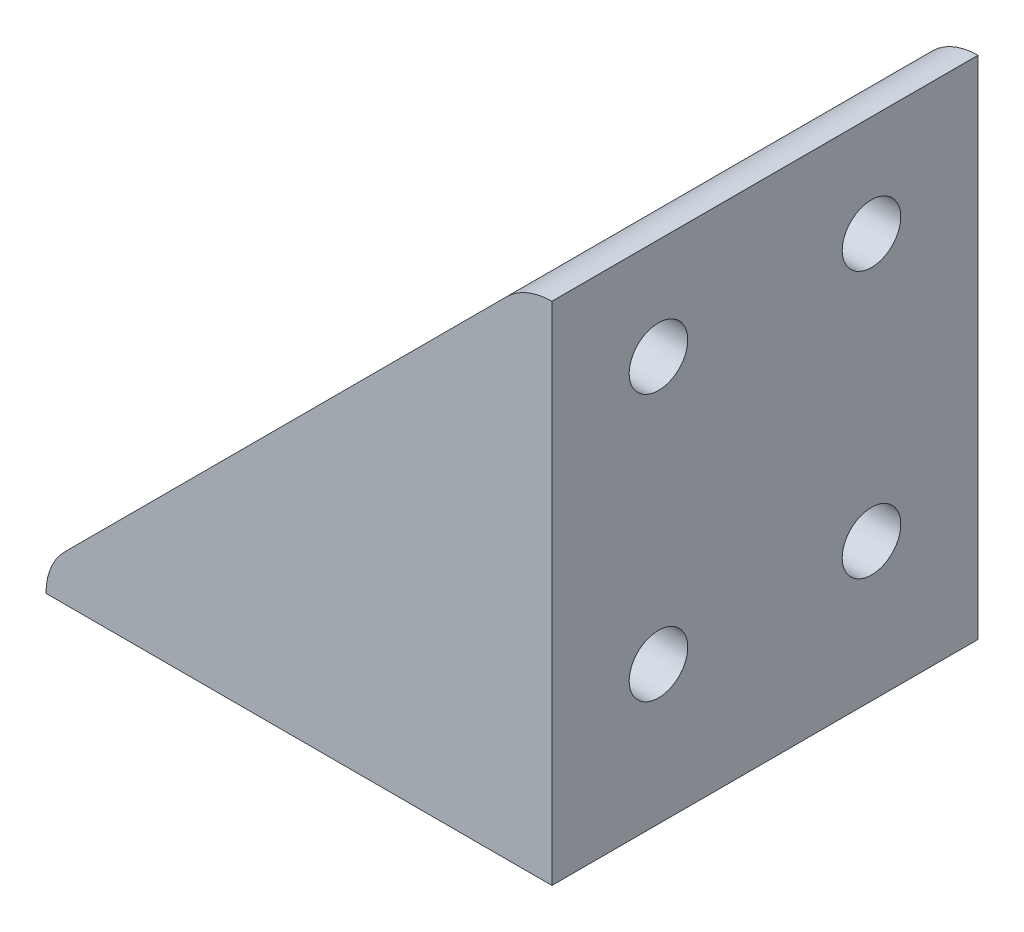
ISO-10303-21;
HEADER;
FILE_DESCRIPTION(('STEP AP214'),'2;1');
FILE_NAME('part.step','',(''),(''),'','','');
FILE_SCHEMA(('AUTOMOTIVE_DESIGN { 1 0 10303 214 1 1 1 1 }'));
ENDSEC;
DATA;
#1=APPLICATION_CONTEXT('core data for automotive mechanical design processes');
#2=APPLICATION_PROTOCOL_DEFINITION('international standard','automotive_design',2000,#1);
#3=PRODUCT_CONTEXT('',#1,'mechanical');
#4=PRODUCT('Part','Part','',(#3));
#5=PRODUCT_RELATED_PRODUCT_CATEGORY('part','',(#4));
#6=PRODUCT_DEFINITION_FORMATION('','',#4);
#7=PRODUCT_DEFINITION_CONTEXT('part definition',#1,'design');
#8=PRODUCT_DEFINITION('design','',#6,#7);
#9=PRODUCT_DEFINITION_SHAPE('','',#8);
#10=(LENGTH_UNIT() NAMED_UNIT(*) SI_UNIT(.MILLI.,.METRE.));
#11=(NAMED_UNIT(*) PLANE_ANGLE_UNIT() SI_UNIT($,.RADIAN.));
#12=(NAMED_UNIT(*) SI_UNIT($,.STERADIAN.) SOLID_ANGLE_UNIT());
#13=UNCERTAINTY_MEASURE_WITH_UNIT(LENGTH_MEASURE(1.E-05),#10,'distance_accuracy_value','');
#14=(GEOMETRIC_REPRESENTATION_CONTEXT(3) GLOBAL_UNCERTAINTY_ASSIGNED_CONTEXT((#13)) GLOBAL_UNIT_ASSIGNED_CONTEXT((#10,
#11,#12)) REPRESENTATION_CONTEXT('',''));
#15=CARTESIAN_POINT('',(0.,0.,0.));
#16=DIRECTION('',(0.,0.,1.));
#17=DIRECTION('',(1.,0.,0.));
#18=AXIS2_PLACEMENT_3D('',#15,#16,#17);
#19=CARTESIAN_POINT('',(20.,50.,20.));
#20=DIRECTION('',(-1.,0.,0.));
#21=DIRECTION('',(0.,0.,1.));
#22=AXIS2_PLACEMENT_3D('',#19,#20,#21);
#23=PLANE('',#22);
#24=CARTESIAN_POINT('',(20.,13.,-10.));
#25=DIRECTION('',(-1.,0.,0.));
#26=DIRECTION('',(0.,0.,1.));
#27=AXIS2_PLACEMENT_3D('',#24,#25,#26);
#28=CIRCLE('',#27,2.75);
#29=CARTESIAN_POINT('',(20.,13.,-7.25));
#30=VERTEX_POINT('',#29);
#31=EDGE_CURVE('E283',#30,#30,#28,.T.);
#32=ORIENTED_EDGE('',*,*,#31,.F.);
#33=EDGE_LOOP('',(#32));
#34=FACE_BOUND('',#33,.T.);
#35=CARTESIAN_POINT('',(20.,38.,-10.));
#36=DIRECTION('',(-1.,0.,0.));
#37=DIRECTION('',(0.,0.,1.));
#38=AXIS2_PLACEMENT_3D('',#35,#36,#37);
#39=CIRCLE('',#38,2.75);
#40=CARTESIAN_POINT('',(20.,38.,-7.25));
#41=VERTEX_POINT('',#40);
#42=EDGE_CURVE('E275',#41,#41,#39,.T.);
#43=ORIENTED_EDGE('',*,*,#42,.F.);
#44=EDGE_LOOP('',(#43));
#45=FACE_BOUND('',#44,.T.);
#46=DIRECTION('',(0.,0.,-1.));
#47=VECTOR('',#46,1.);
#48=CARTESIAN_POINT('',(20.,5.,0.));
#49=LINE('',#48,#47);
#50=CARTESIAN_POINT('',(20.,5.,-2.));
#51=VERTEX_POINT('',#50);
#52=CARTESIAN_POINT('',(20.,5.,-16.));
#53=VERTEX_POINT('',#52);
#54=EDGE_CURVE('E305',#51,#53,#49,.T.);
#55=ORIENTED_EDGE('',*,*,#54,.F.);
#56=DIRECTION('',(0.,-1.,0.));
#57=VECTOR('',#56,1.);
#58=CARTESIAN_POINT('',(20.,0.,-2.));
#59=LINE('',#58,#57);
#60=CARTESIAN_POINT('',(20.,45.,-2.));
#61=VERTEX_POINT('',#60);
#62=EDGE_CURVE('E586',#61,#51,#59,.T.);
#63=ORIENTED_EDGE('',*,*,#62,.F.);
#64=DIRECTION('',(0.,0.,-1.));
#65=VECTOR('',#64,1.);
#66=CARTESIAN_POINT('',(20.,45.,-20.));
#67=LINE('',#66,#65);
#68=CARTESIAN_POINT('',(20.,45.,-16.));
#69=VERTEX_POINT('',#68);
#70=EDGE_CURVE('E160',#61,#69,#67,.T.);
#71=ORIENTED_EDGE('',*,*,#70,.T.);
#72=DIRECTION('',(0.,1.,0.));
#73=VECTOR('',#72,1.);
#74=CARTESIAN_POINT('',(20.,5.,-16.));
#75=LINE('',#74,#73);
#76=EDGE_CURVE('E271',#53,#69,#75,.T.);
#77=ORIENTED_EDGE('',*,*,#76,.F.);
#78=EDGE_LOOP('',(#55,#63,#71,#77));
#79=FACE_BOUND('',#78,.T.);
#80=ADVANCED_FACE('F39',(#34,#45,#79),#23,.T.);
#81=CARTESIAN_POINT('',(0.,5.,0.));
#82=DIRECTION('',(0.,-1.,0.));
#83=DIRECTION('',(0.,0.,-1.));
#84=AXIS2_PLACEMENT_3D('',#81,#82,#83);
#85=PLANE('',#84);
#86=CARTESIAN_POINT('',(12.,5.,-10.));
#87=DIRECTION('',(0.,1.,0.));
#88=DIRECTION('',(0.,0.,1.));
#89=AXIS2_PLACEMENT_3D('',#86,#87,#88);
#90=CIRCLE('',#89,2.74999999999999);
#91=CARTESIAN_POINT('',(12.,5.,-7.25000000000002));
#92=VERTEX_POINT('',#91);
#93=EDGE_CURVE('E593',#92,#92,#90,.T.);
#94=ORIENTED_EDGE('',*,*,#93,.F.);
#95=EDGE_LOOP('',(#94));
#96=FACE_BOUND('',#95,.T.);
#97=CARTESIAN_POINT('',(-13.,5.,-10.));
#98=DIRECTION('',(0.,1.,0.));
#99=DIRECTION('',(0.,0.,1.));
#100=AXIS2_PLACEMENT_3D('',#97,#98,#99);
#101=CIRCLE('',#100,2.74999999999999);
#102=CARTESIAN_POINT('',(-13.,5.,-7.25000000000002));
#103=VERTEX_POINT('',#102);
#104=EDGE_CURVE('E614',#103,#103,#101,.T.);
#105=ORIENTED_EDGE('',*,*,#104,.F.);
#106=EDGE_LOOP('',(#105));
#107=FACE_BOUND('',#106,.T.);
#108=DIRECTION('',(1.,0.,0.));
#109=VECTOR('',#108,1.);
#110=CARTESIAN_POINT('',(0.,5.,-2.));
#111=LINE('',#110,#109);
#112=CARTESIAN_POINT('',(-20.,5.,-2.));
#113=VERTEX_POINT('',#112);
#114=EDGE_CURVE('E591',#113,#51,#111,.T.);
#115=ORIENTED_EDGE('',*,*,#114,.T.);
#116=ORIENTED_EDGE('',*,*,#54,.T.);
#117=DIRECTION('',(1.,0.,0.));
#118=VECTOR('',#117,1.);
#119=CARTESIAN_POINT('',(-20.,5.,-16.));
#120=LINE('',#119,#118);
#121=CARTESIAN_POINT('',(-20.,5.,-16.));
#122=VERTEX_POINT('',#121);
#123=EDGE_CURVE('E267',#122,#53,#120,.T.);
#124=ORIENTED_EDGE('',*,*,#123,.F.);
#125=DIRECTION('',(0.,0.,1.));
#126=VECTOR('',#125,1.);
#127=CARTESIAN_POINT('',(-20.,5.,0.));
#128=LINE('',#127,#126);
#129=EDGE_CURVE('E167',#122,#113,#128,.T.);
#130=ORIENTED_EDGE('',*,*,#129,.T.);
#131=EDGE_LOOP('',(#115,#116,#124,#130));
#132=FACE_BOUND('',#131,.T.);
#133=ADVANCED_FACE('F334',(#96,#107,#132),#85,.F.);
#134=CARTESIAN_POINT('',(-25.,0.,-20.));
#135=DIRECTION('',(0.707106781186548,-0.707106781186548,0.));
#136=DIRECTION('',(0.707106781186548,0.707106781186548,0.));
#137=AXIS2_PLACEMENT_3D('',#134,#135,#136);
#138=PLANE('',#137);
#139=DIRECTION('',(-0.707106781186547,-0.707106781186548,0.));
#140=VECTOR('',#139,1.);
#141=CARTESIAN_POINT('',(-12.5,12.5,2.));
#142=LINE('',#141,#140);
#143=CARTESIAN_POINT('',(20.,45.,2.));
#144=VERTEX_POINT('',#143);
#145=CARTESIAN_POINT('',(-20.,5.,2.));
#146=VERTEX_POINT('',#145);
#147=EDGE_CURVE('E56',#144,#146,#142,.T.);
#148=ORIENTED_EDGE('',*,*,#147,.F.);
#149=CARTESIAN_POINT('',(20.,45.,16.));
#150=VERTEX_POINT('',#149);
#151=EDGE_CURVE('E140',#150,#144,#67,.T.);
#152=ORIENTED_EDGE('',*,*,#151,.F.);
#153=DIRECTION('',(0.707106781186547,0.707106781186548,0.));
#154=VECTOR('',#153,1.);
#155=CARTESIAN_POINT('',(-20.,5.,16.));
#156=LINE('',#155,#154);
#157=CARTESIAN_POINT('',(-20.,5.,16.));
#158=VERTEX_POINT('',#157);
#159=EDGE_CURVE('E249',#158,#150,#156,.T.);
#160=ORIENTED_EDGE('',*,*,#159,.F.);
#161=EDGE_CURVE('E142',#146,#158,#128,.T.);
#162=ORIENTED_EDGE('',*,*,#161,.F.);
#163=EDGE_LOOP('',(#148,#152,#160,#162));
#164=FACE_BOUND('',#163,.T.);
#165=DIRECTION('',(0.707106781186547,0.707106781186547,0.));
#166=VECTOR('',#165,1.);
#167=CARTESIAN_POINT('',(-25.,0.,-20.));
#168=LINE('',#167,#166);
#169=CARTESIAN_POINT('',(-20.7426406871193,4.25735931288071,-20.));
#170=VERTEX_POINT('',#169);
#171=CARTESIAN_POINT('',(20.7426406871193,45.7426406871193,-20.));
#172=VERTEX_POINT('',#171);
#173=EDGE_CURVE('E165',#170,#172,#168,.T.);
#174=ORIENTED_EDGE('',*,*,#173,.F.);
#175=DIRECTION('',(0.,0.,1.));
#176=VECTOR('',#175,1.);
#177=CARTESIAN_POINT('',(-20.7426406871193,4.25735931288071,-20.));
#178=LINE('',#177,#176);
#179=CARTESIAN_POINT('',(-20.7426406871193,4.25735931288071,20.));
#180=VERTEX_POINT('',#179);
#181=EDGE_CURVE('E198',#170,#180,#178,.T.);
#182=ORIENTED_EDGE('',*,*,#181,.T.);
#183=DIRECTION('',(0.707106781186547,0.707106781186547,0.));
#184=VECTOR('',#183,1.);
#185=CARTESIAN_POINT('',(-25.,0.,20.));
#186=LINE('',#185,#184);
#187=CARTESIAN_POINT('',(20.7426406871193,45.7426406871193,20.));
#188=VERTEX_POINT('',#187);
#189=EDGE_CURVE('E159',#180,#188,#186,.T.);
#190=ORIENTED_EDGE('',*,*,#189,.T.);
#191=DIRECTION('',(0.,0.,1.));
#192=VECTOR('',#191,1.);
#193=CARTESIAN_POINT('',(20.7426406871193,45.7426406871193,-20.));
#194=LINE('',#193,#192);
#195=EDGE_CURVE('E195',#188,#172,#194,.F.);
#196=ORIENTED_EDGE('',*,*,#195,.T.);
#197=EDGE_LOOP('',(#174,#182,#190,#196));
#198=FACE_BOUND('',#197,.T.);
#199=ORIENTED_EDGE('',*,*,#70,.F.);
#200=DIRECTION('',(-0.707106781186547,-0.707106781186548,0.));
#201=VECTOR('',#200,1.);
#202=CARTESIAN_POINT('',(-12.5,12.5,-2.));
#203=LINE('',#202,#201);
#204=EDGE_CURVE('E589',#61,#113,#203,.T.);
#205=ORIENTED_EDGE('',*,*,#204,.T.);
#206=ORIENTED_EDGE('',*,*,#129,.F.);
#207=DIRECTION('',(-0.707106781186547,-0.707106781186548,0.));
#208=VECTOR('',#207,1.);
#209=CARTESIAN_POINT('',(20.,45.,-16.));
#210=LINE('',#209,#208);
#211=EDGE_CURVE('E263',#69,#122,#210,.T.);
#212=ORIENTED_EDGE('',*,*,#211,.F.);
#213=EDGE_LOOP('',(#199,#205,#206,#212));
#214=FACE_BOUND('',#213,.T.);
#215=ADVANCED_FACE('F136',(#164,#198,#214),#138,.F.);
#216=CARTESIAN_POINT('',(25.,50.,20.));
#217=DIRECTION('',(-1.,0.,0.));
#218=DIRECTION('',(0.,0.,1.));
#219=AXIS2_PLACEMENT_3D('',#216,#217,#218);
#220=PLANE('',#219);
#221=CARTESIAN_POINT('',(25.,38.,-10.));
#222=DIRECTION('',(-1.,0.,0.));
#223=DIRECTION('',(0.,0.,1.));
#224=AXIS2_PLACEMENT_3D('',#221,#222,#223);
#225=CIRCLE('',#224,2.75);
#226=CARTESIAN_POINT('',(25.,38.,-7.25));
#227=VERTEX_POINT('',#226);
#228=EDGE_CURVE('E279',#227,#227,#225,.T.);
#229=ORIENTED_EDGE('',*,*,#228,.T.);
#230=EDGE_LOOP('',(#229));
#231=FACE_BOUND('',#230,.T.);
#232=CARTESIAN_POINT('',(25.,13.,-10.));
#233=DIRECTION('',(-1.,0.,0.));
#234=DIRECTION('',(0.,0.,1.));
#235=AXIS2_PLACEMENT_3D('',#232,#233,#234);
#236=CIRCLE('',#235,2.75);
#237=CARTESIAN_POINT('',(25.,13.,-7.25));
#238=VERTEX_POINT('',#237);
#239=EDGE_CURVE('E287',#238,#238,#236,.T.);
#240=ORIENTED_EDGE('',*,*,#239,.T.);
#241=EDGE_LOOP('',(#240));
#242=FACE_BOUND('',#241,.T.);
#243=CARTESIAN_POINT('',(25.,13.,10.));
#244=DIRECTION('',(-1.,0.,0.));
#245=DIRECTION('',(0.,0.,1.));
#246=AXIS2_PLACEMENT_3D('',#243,#244,#245);
#247=CIRCLE('',#246,2.75);
#248=CARTESIAN_POINT('',(25.,13.,12.75));
#249=VERTEX_POINT('',#248);
#250=EDGE_CURVE('E295',#249,#249,#247,.T.);
#251=ORIENTED_EDGE('',*,*,#250,.T.);
#252=EDGE_LOOP('',(#251));
#253=FACE_BOUND('',#252,.T.);
#254=CARTESIAN_POINT('',(25.,38.,10.));
#255=DIRECTION('',(-1.,0.,0.));
#256=DIRECTION('',(0.,0.,1.));
#257=AXIS2_PLACEMENT_3D('',#254,#255,#256);
#258=CIRCLE('',#257,2.75);
#259=CARTESIAN_POINT('',(25.,38.,12.75));
#260=VERTEX_POINT('',#259);
#261=EDGE_CURVE('E302',#260,#260,#258,.T.);
#262=ORIENTED_EDGE('',*,*,#261,.T.);
#263=EDGE_LOOP('',(#262));
#264=FACE_BOUND('',#263,.T.);
#265=DIRECTION('',(0.,-1.,0.));
#266=VECTOR('',#265,1.);
#267=CARTESIAN_POINT('',(25.,50.,-20.));
#268=LINE('',#267,#266);
#269=CARTESIAN_POINT('',(25.,47.5,-20.));
#270=VERTEX_POINT('',#269);
#271=CARTESIAN_POINT('',(25.,0.,-20.));
#272=VERTEX_POINT('',#271);
#273=EDGE_CURVE('E192',#270,#272,#268,.T.);
#274=ORIENTED_EDGE('',*,*,#273,.F.);
#275=DIRECTION('',(0.,0.,1.));
#276=VECTOR('',#275,1.);
#277=CARTESIAN_POINT('',(25.,47.5,-20.));
#278=LINE('',#277,#276);
#279=CARTESIAN_POINT('',(25.,47.5,20.));
#280=VERTEX_POINT('',#279);
#281=EDGE_CURVE('E237',#270,#280,#278,.T.);
#282=ORIENTED_EDGE('',*,*,#281,.T.);
#283=DIRECTION('',(0.,-1.,0.));
#284=VECTOR('',#283,1.);
#285=CARTESIAN_POINT('',(25.,50.,20.));
#286=LINE('',#285,#284);
#287=CARTESIAN_POINT('',(25.,0.,20.));
#288=VERTEX_POINT('',#287);
#289=EDGE_CURVE('E189',#280,#288,#286,.T.);
#290=ORIENTED_EDGE('',*,*,#289,.T.);
#291=DIRECTION('',(0.,0.,-1.));
#292=VECTOR('',#291,1.);
#293=CARTESIAN_POINT('',(25.,0.,20.));
#294=LINE('',#293,#292);
#295=EDGE_CURVE('E176',#288,#272,#294,.T.);
#296=ORIENTED_EDGE('',*,*,#295,.T.);
#297=EDGE_LOOP('',(#274,#282,#290,#296));
#298=FACE_BOUND('',#297,.T.);
#299=ADVANCED_FACE('F369',(#231,#242,#253,#264,#298),#220,.F.);
#300=CARTESIAN_POINT('',(-25.,50.,-20.));
#301=DIRECTION('',(0.,0.,1.));
#302=DIRECTION('',(1.,0.,0.));
#303=AXIS2_PLACEMENT_3D('',#300,#301,#302);
#304=PLANE('',#303);
#305=DIRECTION('',(0.,1.,0.));
#306=VECTOR('',#305,1.);
#307=CARTESIAN_POINT('',(-22.5,2.5,-20.));
#308=LINE('',#307,#306);
#309=CARTESIAN_POINT('',(-22.5,0.,-20.));
#310=VERTEX_POINT('',#309);
#311=CARTESIAN_POINT('',(-22.5,0.014718625761424,-20.));
#312=VERTEX_POINT('',#311);
#313=EDGE_CURVE('E218',#310,#312,#308,.T.);
#314=ORIENTED_EDGE('',*,*,#313,.T.);
#315=CARTESIAN_POINT('',(-16.5,0.014718625761424,-20.));
#316=DIRECTION('',(0.,0.,1.));
#317=DIRECTION('',(1.,0.,0.));
#318=AXIS2_PLACEMENT_3D('',#315,#316,#317);
#319=CIRCLE('',#318,6.);
#320=EDGE_CURVE('E49',#312,#170,#319,.F.);
#321=ORIENTED_EDGE('',*,*,#320,.T.);
#322=ORIENTED_EDGE('',*,*,#173,.T.);
#323=CARTESIAN_POINT('',(24.9852813742386,41.5,-20.));
#324=DIRECTION('',(0.,0.,1.));
#325=DIRECTION('',(1.,0.,0.));
#326=AXIS2_PLACEMENT_3D('',#323,#324,#325);
#327=CIRCLE('',#326,6.);
#328=CARTESIAN_POINT('',(24.9852813742386,47.5,-20.));
#329=VERTEX_POINT('',#328);
#330=EDGE_CURVE('E64',#172,#329,#327,.F.);
#331=ORIENTED_EDGE('',*,*,#330,.T.);
#332=DIRECTION('',(1.,0.,0.));
#333=VECTOR('',#332,1.);
#334=CARTESIAN_POINT('',(22.5,47.5,-20.));
#335=LINE('',#334,#333);
#336=EDGE_CURVE('E243',#329,#270,#335,.T.);
#337=ORIENTED_EDGE('',*,*,#336,.T.);
#338=ORIENTED_EDGE('',*,*,#273,.T.);
#339=DIRECTION('',(-1.,0.,0.));
#340=VECTOR('',#339,1.);
#341=CARTESIAN_POINT('',(-25.,0.,-20.));
#342=LINE('',#341,#340);
#343=EDGE_CURVE('E181',#272,#310,#342,.T.);
#344=ORIENTED_EDGE('',*,*,#343,.T.);
#345=EDGE_LOOP('',(#314,#321,#322,#331,#337,#338,#344));
#346=FACE_BOUND('',#345,.T.);
#347=ADVANCED_FACE('F217',(#346),#304,.F.);
#348=CARTESIAN_POINT('',(-25.,50.,20.));
#349=DIRECTION('',(0.,0.,-1.));
#350=DIRECTION('',(-1.,0.,0.));
#351=AXIS2_PLACEMENT_3D('',#348,#349,#350);
#352=PLANE('',#351);
#353=ORIENTED_EDGE('',*,*,#189,.F.);
#354=CARTESIAN_POINT('',(-16.5,0.014718625761424,20.));
#355=DIRECTION('',(0.,0.,-1.));
#356=DIRECTION('',(-1.,0.,0.));
#357=AXIS2_PLACEMENT_3D('',#354,#355,#356);
#358=CIRCLE('',#357,6.);
#359=CARTESIAN_POINT('',(-22.5,0.014718625761424,20.));
#360=VERTEX_POINT('',#359);
#361=EDGE_CURVE('E205',#180,#360,#358,.F.);
#362=ORIENTED_EDGE('',*,*,#361,.T.);
#363=DIRECTION('',(0.,1.,0.));
#364=VECTOR('',#363,1.);
#365=CARTESIAN_POINT('',(-22.5,2.5,20.));
#366=LINE('',#365,#364);
#367=CARTESIAN_POINT('',(-22.5,0.,20.));
#368=VERTEX_POINT('',#367);
#369=EDGE_CURVE('E230',#368,#360,#366,.T.);
#370=ORIENTED_EDGE('',*,*,#369,.F.);
#371=DIRECTION('',(1.,0.,0.));
#372=VECTOR('',#371,1.);
#373=CARTESIAN_POINT('',(-25.,0.,20.));
#374=LINE('',#373,#372);
#375=EDGE_CURVE('E185',#368,#288,#374,.T.);
#376=ORIENTED_EDGE('',*,*,#375,.T.);
#377=ORIENTED_EDGE('',*,*,#289,.F.);
#378=DIRECTION('',(1.,0.,0.));
#379=VECTOR('',#378,1.);
#380=CARTESIAN_POINT('',(22.5,47.5,20.));
#381=LINE('',#380,#379);
#382=CARTESIAN_POINT('',(24.9852813742386,47.5,20.));
#383=VERTEX_POINT('',#382);
#384=EDGE_CURVE('E252',#383,#280,#381,.T.);
#385=ORIENTED_EDGE('',*,*,#384,.F.);
#386=CARTESIAN_POINT('',(24.9852813742386,41.5,20.));
#387=DIRECTION('',(0.,0.,-1.));
#388=DIRECTION('',(-1.,0.,0.));
#389=AXIS2_PLACEMENT_3D('',#386,#387,#388);
#390=CIRCLE('',#389,6.);
#391=EDGE_CURVE('E202',#383,#188,#390,.F.);
#392=ORIENTED_EDGE('',*,*,#391,.T.);
#393=EDGE_LOOP('',(#353,#362,#370,#376,#377,#385,#392));
#394=FACE_BOUND('',#393,.T.);
#395=ADVANCED_FACE('F229',(#394),#352,.F.);
#396=CARTESIAN_POINT('',(0.,0.,0.));
#397=DIRECTION('',(0.,-1.,0.));
#398=DIRECTION('',(0.,0.,-1.));
#399=AXIS2_PLACEMENT_3D('',#396,#397,#398);
#400=PLANE('',#399);
#401=CARTESIAN_POINT('',(12.,0.,-10.));
#402=DIRECTION('',(0.,-1.,0.));
#403=DIRECTION('',(0.,0.,-1.));
#404=AXIS2_PLACEMENT_3D('',#401,#402,#403);
#405=CIRCLE('',#404,2.74999999999999);
#406=CARTESIAN_POINT('',(12.,0.,-12.75));
#407=VERTEX_POINT('',#406);
#408=EDGE_CURVE('E598',#407,#407,#405,.T.);
#409=ORIENTED_EDGE('',*,*,#408,.F.);
#410=EDGE_LOOP('',(#409));
#411=FACE_BOUND('',#410,.T.);
#412=CARTESIAN_POINT('',(12.,0.,9.99999999999999));
#413=DIRECTION('',(0.,-1.,0.));
#414=DIRECTION('',(0.,0.,-1.));
#415=AXIS2_PLACEMENT_3D('',#412,#413,#414);
#416=CIRCLE('',#415,2.74999999999999);
#417=CARTESIAN_POINT('',(12.,0.,7.25000000000001));
#418=VERTEX_POINT('',#417);
#419=EDGE_CURVE('E610',#418,#418,#416,.T.);
#420=ORIENTED_EDGE('',*,*,#419,.F.);
#421=EDGE_LOOP('',(#420));
#422=FACE_BOUND('',#421,.T.);
#423=CARTESIAN_POINT('',(-13.,0.,-10.));
#424=DIRECTION('',(0.,-1.,0.));
#425=DIRECTION('',(0.,0.,-1.));
#426=AXIS2_PLACEMENT_3D('',#423,#424,#425);
#427=CIRCLE('',#426,2.74999999999999);
#428=CARTESIAN_POINT('',(-13.,0.,-12.75));
#429=VERTEX_POINT('',#428);
#430=EDGE_CURVE('E618',#429,#429,#427,.T.);
#431=ORIENTED_EDGE('',*,*,#430,.F.);
#432=EDGE_LOOP('',(#431));
#433=FACE_BOUND('',#432,.T.);
#434=CARTESIAN_POINT('',(-13.,0.,9.99999999999999));
#435=DIRECTION('',(0.,-1.,0.));
#436=DIRECTION('',(0.,0.,-1.));
#437=AXIS2_PLACEMENT_3D('',#434,#435,#436);
#438=CIRCLE('',#437,2.74999999999999);
#439=CARTESIAN_POINT('',(-13.,0.,7.25000000000001));
#440=VERTEX_POINT('',#439);
#441=EDGE_CURVE('E43',#440,#440,#438,.T.);
#442=ORIENTED_EDGE('',*,*,#441,.F.);
#443=EDGE_LOOP('',(#442));
#444=FACE_BOUND('',#443,.T.);
#445=DIRECTION('',(0.,0.,1.));
#446=VECTOR('',#445,1.);
#447=CARTESIAN_POINT('',(-22.5,0.,-20.));
#448=LINE('',#447,#446);
#449=EDGE_CURVE('E235',#310,#368,#448,.T.);
#450=ORIENTED_EDGE('',*,*,#449,.F.);
#451=ORIENTED_EDGE('',*,*,#343,.F.);
#452=ORIENTED_EDGE('',*,*,#295,.F.);
#453=ORIENTED_EDGE('',*,*,#375,.F.);
#454=EDGE_LOOP('',(#450,#451,#452,#453));
#455=FACE_BOUND('',#454,.T.);
#456=ADVANCED_FACE('F347',(#411,#422,#433,#444,#455),#400,.T.);
#457=DIRECTION('',(0.,-1.,0.));
#458=VECTOR('',#457,1.);
#459=CARTESIAN_POINT('',(20.,0.,2.));
#460=LINE('',#459,#458);
#461=CARTESIAN_POINT('',(20.,5.,2.));
#462=VERTEX_POINT('',#461);
#463=EDGE_CURVE('E145',#144,#462,#460,.T.);
#464=ORIENTED_EDGE('',*,*,#463,.T.);
#465=CARTESIAN_POINT('',(20.,5.,16.));
#466=VERTEX_POINT('',#465);
#467=EDGE_CURVE('E170',#466,#462,#49,.T.);
#468=ORIENTED_EDGE('',*,*,#467,.F.);
#469=DIRECTION('',(0.,-1.,0.));
#470=VECTOR('',#469,1.);
#471=CARTESIAN_POINT('',(20.,45.,16.));
#472=LINE('',#471,#470);
#473=EDGE_CURVE('E156',#150,#466,#472,.T.);
#474=ORIENTED_EDGE('',*,*,#473,.F.);
#475=ORIENTED_EDGE('',*,*,#151,.T.);
#476=EDGE_LOOP('',(#464,#468,#474,#475));
#477=FACE_BOUND('',#476,.T.);
#478=CARTESIAN_POINT('',(20.,13.,10.));
#479=DIRECTION('',(-1.,0.,0.));
#480=DIRECTION('',(0.,0.,1.));
#481=AXIS2_PLACEMENT_3D('',#478,#479,#480);
#482=CIRCLE('',#481,2.75);
#483=CARTESIAN_POINT('',(20.,13.,12.75));
#484=VERTEX_POINT('',#483);
#485=EDGE_CURVE('E291',#484,#484,#482,.T.);
#486=ORIENTED_EDGE('',*,*,#485,.F.);
#487=EDGE_LOOP('',(#486));
#488=FACE_BOUND('',#487,.T.);
#489=CARTESIAN_POINT('',(20.,38.,10.));
#490=DIRECTION('',(-1.,0.,0.));
#491=DIRECTION('',(0.,0.,1.));
#492=AXIS2_PLACEMENT_3D('',#489,#490,#491);
#493=CIRCLE('',#492,2.75);
#494=CARTESIAN_POINT('',(20.,38.,12.75));
#495=VERTEX_POINT('',#494);
#496=EDGE_CURVE('E299',#495,#495,#493,.T.);
#497=ORIENTED_EDGE('',*,*,#496,.F.);
#498=EDGE_LOOP('',(#497));
#499=FACE_BOUND('',#498,.T.);
#500=ADVANCED_FACE('F153',(#477,#488,#499),#23,.T.);
#501=CARTESIAN_POINT('',(12.,5.,9.99999999999999));
#502=DIRECTION('',(0.,1.,0.));
#503=DIRECTION('',(0.,0.,1.));
#504=AXIS2_PLACEMENT_3D('',#501,#502,#503);
#505=CIRCLE('',#504,2.74999999999999);
#506=CARTESIAN_POINT('',(12.,5.,12.75));
#507=VERTEX_POINT('',#506);
#508=EDGE_CURVE('E606',#507,#507,#505,.T.);
#509=ORIENTED_EDGE('',*,*,#508,.F.);
#510=EDGE_LOOP('',(#509));
#511=FACE_BOUND('',#510,.T.);
#512=CARTESIAN_POINT('',(-13.,5.,9.99999999999999));
#513=DIRECTION('',(0.,1.,0.));
#514=DIRECTION('',(0.,0.,1.));
#515=AXIS2_PLACEMENT_3D('',#512,#513,#514);
#516=CIRCLE('',#515,2.74999999999999);
#517=CARTESIAN_POINT('',(-13.,5.,12.75));
#518=VERTEX_POINT('',#517);
#519=EDGE_CURVE('E621',#518,#518,#516,.T.);
#520=ORIENTED_EDGE('',*,*,#519,.F.);
#521=EDGE_LOOP('',(#520));
#522=FACE_BOUND('',#521,.T.);
#523=ORIENTED_EDGE('',*,*,#467,.T.);
#524=DIRECTION('',(1.,0.,0.));
#525=VECTOR('',#524,1.);
#526=CARTESIAN_POINT('',(0.,5.,2.));
#527=LINE('',#526,#525);
#528=EDGE_CURVE('E144',#146,#462,#527,.T.);
#529=ORIENTED_EDGE('',*,*,#528,.F.);
#530=ORIENTED_EDGE('',*,*,#161,.T.);
#531=DIRECTION('',(-1.,0.,0.));
#532=VECTOR('',#531,1.);
#533=CARTESIAN_POINT('',(20.,5.,16.));
#534=LINE('',#533,#532);
#535=EDGE_CURVE('E259',#466,#158,#534,.T.);
#536=ORIENTED_EDGE('',*,*,#535,.F.);
#537=EDGE_LOOP('',(#523,#529,#530,#536));
#538=FACE_BOUND('',#537,.T.);
#539=ADVANCED_FACE('F317',(#511,#522,#538),#85,.F.);
#540=CARTESIAN_POINT('',(20.,38.,10.));
#541=DIRECTION('',(-1.,0.,0.));
#542=DIRECTION('',(0.,0.,1.));
#543=AXIS2_PLACEMENT_3D('',#540,#541,#542);
#544=CYLINDRICAL_SURFACE('',#543,2.75);
#545=ORIENTED_EDGE('',*,*,#496,.T.);
#546=EDGE_LOOP('',(#545));
#547=FACE_BOUND('',#546,.T.);
#548=ORIENTED_EDGE('',*,*,#261,.F.);
#549=EDGE_LOOP('',(#548));
#550=FACE_BOUND('',#549,.T.);
#551=ADVANCED_FACE('F352',(#547,#550),#544,.F.);
#552=CARTESIAN_POINT('',(20.,13.,10.));
#553=DIRECTION('',(-1.,0.,0.));
#554=DIRECTION('',(0.,0.,1.));
#555=AXIS2_PLACEMENT_3D('',#552,#553,#554);
#556=CYLINDRICAL_SURFACE('',#555,2.75);
#557=ORIENTED_EDGE('',*,*,#485,.T.);
#558=EDGE_LOOP('',(#557));
#559=FACE_BOUND('',#558,.T.);
#560=ORIENTED_EDGE('',*,*,#250,.F.);
#561=EDGE_LOOP('',(#560));
#562=FACE_BOUND('',#561,.T.);
#563=ADVANCED_FACE('F502',(#559,#562),#556,.F.);
#564=CARTESIAN_POINT('',(20.,13.,-10.));
#565=DIRECTION('',(-1.,0.,0.));
#566=DIRECTION('',(0.,0.,1.));
#567=AXIS2_PLACEMENT_3D('',#564,#565,#566);
#568=CYLINDRICAL_SURFACE('',#567,2.75);
#569=ORIENTED_EDGE('',*,*,#31,.T.);
#570=EDGE_LOOP('',(#569));
#571=FACE_BOUND('',#570,.T.);
#572=ORIENTED_EDGE('',*,*,#239,.F.);
#573=EDGE_LOOP('',(#572));
#574=FACE_BOUND('',#573,.T.);
#575=ADVANCED_FACE('F491',(#571,#574),#568,.F.);
#576=CARTESIAN_POINT('',(20.,38.,-10.));
#577=DIRECTION('',(-1.,0.,0.));
#578=DIRECTION('',(0.,0.,1.));
#579=AXIS2_PLACEMENT_3D('',#576,#577,#578);
#580=CYLINDRICAL_SURFACE('',#579,2.75);
#581=ORIENTED_EDGE('',*,*,#42,.T.);
#582=EDGE_LOOP('',(#581));
#583=FACE_BOUND('',#582,.T.);
#584=ORIENTED_EDGE('',*,*,#228,.F.);
#585=EDGE_LOOP('',(#584));
#586=FACE_BOUND('',#585,.T.);
#587=ADVANCED_FACE('F329',(#583,#586),#580,.F.);
#588=CARTESIAN_POINT('',(0.,0.,-16.));
#589=DIRECTION('',(0.,0.,1.));
#590=DIRECTION('',(1.,0.,0.));
#591=AXIS2_PLACEMENT_3D('',#588,#589,#590);
#592=PLANE('',#591);
#593=ORIENTED_EDGE('',*,*,#211,.T.);
#594=ORIENTED_EDGE('',*,*,#123,.T.);
#595=ORIENTED_EDGE('',*,*,#76,.T.);
#596=EDGE_LOOP('',(#593,#594,#595));
#597=FACE_BOUND('',#596,.T.);
#598=ADVANCED_FACE('F321',(#597),#592,.T.);
#599=CARTESIAN_POINT('',(0.,0.,16.));
#600=DIRECTION('',(0.,0.,-1.));
#601=DIRECTION('',(-1.,0.,0.));
#602=AXIS2_PLACEMENT_3D('',#599,#600,#601);
#603=PLANE('',#602);
#604=ORIENTED_EDGE('',*,*,#159,.T.);
#605=ORIENTED_EDGE('',*,*,#473,.T.);
#606=ORIENTED_EDGE('',*,*,#535,.T.);
#607=EDGE_LOOP('',(#604,#605,#606));
#608=FACE_BOUND('',#607,.T.);
#609=ADVANCED_FACE('F319',(#608),#603,.T.);
#610=CARTESIAN_POINT('',(-22.5,2.5,-20.));
#611=DIRECTION('',(1.,0.,0.));
#612=DIRECTION('',(0.,0.,-1.));
#613=AXIS2_PLACEMENT_3D('',#610,#611,#612);
#614=PLANE('',#613);
#615=ORIENTED_EDGE('',*,*,#369,.T.);
#616=DIRECTION('',(0.,0.,1.));
#617=VECTOR('',#616,1.);
#618=CARTESIAN_POINT('',(-22.5,0.014718625761424,-20.));
#619=LINE('',#618,#617);
#620=EDGE_CURVE('E208',#360,#312,#619,.F.);
#621=ORIENTED_EDGE('',*,*,#620,.T.);
#622=ORIENTED_EDGE('',*,*,#313,.F.);
#623=ORIENTED_EDGE('',*,*,#449,.T.);
#624=EDGE_LOOP('',(#615,#621,#622,#623));
#625=FACE_BOUND('',#624,.T.);
#626=ADVANCED_FACE('F233',(#625),#614,.F.);
#627=CARTESIAN_POINT('',(22.5,47.5,-20.));
#628=DIRECTION('',(0.,-1.,0.));
#629=DIRECTION('',(1.,0.,0.));
#630=AXIS2_PLACEMENT_3D('',#627,#628,#629);
#631=PLANE('',#630);
#632=ORIENTED_EDGE('',*,*,#336,.F.);
#633=DIRECTION('',(0.,0.,1.));
#634=VECTOR('',#633,1.);
#635=CARTESIAN_POINT('',(24.9852813742386,47.5,-20.));
#636=LINE('',#635,#634);
#637=EDGE_CURVE('E11',#329,#383,#636,.T.);
#638=ORIENTED_EDGE('',*,*,#637,.T.);
#639=ORIENTED_EDGE('',*,*,#384,.T.);
#640=ORIENTED_EDGE('',*,*,#281,.F.);
#641=EDGE_LOOP('',(#632,#638,#639,#640));
#642=FACE_BOUND('',#641,.T.);
#643=ADVANCED_FACE('F327',(#642),#631,.F.);
#644=CARTESIAN_POINT('',(-16.5,0.014718625761424,-20.));
#645=DIRECTION('',(0.,0.,1.));
#646=DIRECTION('',(1.,0.,0.));
#647=AXIS2_PLACEMENT_3D('',#644,#645,#646);
#648=CYLINDRICAL_SURFACE('',#647,6.);
#649=ORIENTED_EDGE('',*,*,#320,.F.);
#650=ORIENTED_EDGE('',*,*,#620,.F.);
#651=ORIENTED_EDGE('',*,*,#361,.F.);
#652=ORIENTED_EDGE('',*,*,#181,.F.);
#653=EDGE_LOOP('',(#649,#650,#651,#652));
#654=FACE_BOUND('',#653,.T.);
#655=ADVANCED_FACE('F225',(#654),#648,.T.);
#656=CARTESIAN_POINT('',(24.9852813742386,41.5,-20.));
#657=DIRECTION('',(0.,0.,1.));
#658=DIRECTION('',(1.,0.,0.));
#659=AXIS2_PLACEMENT_3D('',#656,#657,#658);
#660=CYLINDRICAL_SURFACE('',#659,6.);
#661=ORIENTED_EDGE('',*,*,#330,.F.);
#662=ORIENTED_EDGE('',*,*,#195,.F.);
#663=ORIENTED_EDGE('',*,*,#391,.F.);
#664=ORIENTED_EDGE('',*,*,#637,.F.);
#665=EDGE_LOOP('',(#661,#662,#663,#664));
#666=FACE_BOUND('',#665,.T.);
#667=ADVANCED_FACE('F41',(#666),#660,.T.);
#668=CARTESIAN_POINT('',(-13.,5.,9.99999999999999));
#669=DIRECTION('',(0.,1.,0.));
#670=DIRECTION('',(0.,0.,1.));
#671=AXIS2_PLACEMENT_3D('',#668,#669,#670);
#672=CYLINDRICAL_SURFACE('',#671,2.74999999999999);
#673=ORIENTED_EDGE('',*,*,#441,.T.);
#674=EDGE_LOOP('',(#673));
#675=FACE_BOUND('',#674,.T.);
#676=ORIENTED_EDGE('',*,*,#519,.T.);
#677=EDGE_LOOP('',(#676));
#678=FACE_BOUND('',#677,.T.);
#679=ADVANCED_FACE('F377',(#675,#678),#672,.F.);
#680=CARTESIAN_POINT('',(-13.,5.,-10.));
#681=DIRECTION('',(0.,1.,0.));
#682=DIRECTION('',(0.,0.,1.));
#683=AXIS2_PLACEMENT_3D('',#680,#681,#682);
#684=CYLINDRICAL_SURFACE('',#683,2.74999999999999);
#685=ORIENTED_EDGE('',*,*,#430,.T.);
#686=EDGE_LOOP('',(#685));
#687=FACE_BOUND('',#686,.T.);
#688=ORIENTED_EDGE('',*,*,#104,.T.);
#689=EDGE_LOOP('',(#688));
#690=FACE_BOUND('',#689,.T.);
#691=ADVANCED_FACE('F385',(#687,#690),#684,.F.);
#692=CARTESIAN_POINT('',(12.,5.,9.99999999999999));
#693=DIRECTION('',(0.,1.,0.));
#694=DIRECTION('',(0.,0.,1.));
#695=AXIS2_PLACEMENT_3D('',#692,#693,#694);
#696=CYLINDRICAL_SURFACE('',#695,2.74999999999999);
#697=ORIENTED_EDGE('',*,*,#419,.T.);
#698=EDGE_LOOP('',(#697));
#699=FACE_BOUND('',#698,.T.);
#700=ORIENTED_EDGE('',*,*,#508,.T.);
#701=EDGE_LOOP('',(#700));
#702=FACE_BOUND('',#701,.T.);
#703=ADVANCED_FACE('F389',(#699,#702),#696,.F.);
#704=CARTESIAN_POINT('',(12.,5.,-10.));
#705=DIRECTION('',(0.,1.,0.));
#706=DIRECTION('',(0.,0.,1.));
#707=AXIS2_PLACEMENT_3D('',#704,#705,#706);
#708=CYLINDRICAL_SURFACE('',#707,2.74999999999999);
#709=ORIENTED_EDGE('',*,*,#408,.T.);
#710=EDGE_LOOP('',(#709));
#711=FACE_BOUND('',#710,.T.);
#712=ORIENTED_EDGE('',*,*,#93,.T.);
#713=EDGE_LOOP('',(#712));
#714=FACE_BOUND('',#713,.T.);
#715=ADVANCED_FACE('F393',(#711,#714),#708,.F.);
#716=CARTESIAN_POINT('',(0.,0.,-2.));
#717=DIRECTION('',(0.,0.,1.));
#718=DIRECTION('',(1.,0.,0.));
#719=AXIS2_PLACEMENT_3D('',#716,#717,#718);
#720=PLANE('',#719);
#721=ORIENTED_EDGE('',*,*,#62,.T.);
#722=ORIENTED_EDGE('',*,*,#114,.F.);
#723=ORIENTED_EDGE('',*,*,#204,.F.);
#724=EDGE_LOOP('',(#721,#722,#723));
#725=FACE_BOUND('',#724,.T.);
#726=ADVANCED_FACE('F397',(#725),#720,.F.);
#727=CARTESIAN_POINT('',(0.,0.,2.));
#728=DIRECTION('',(0.,0.,1.));
#729=DIRECTION('',(1.,0.,0.));
#730=AXIS2_PLACEMENT_3D('',#727,#728,#729);
#731=PLANE('',#730);
#732=ORIENTED_EDGE('',*,*,#463,.F.);
#733=ORIENTED_EDGE('',*,*,#147,.T.);
#734=ORIENTED_EDGE('',*,*,#528,.T.);
#735=EDGE_LOOP('',(#732,#733,#734));
#736=FACE_BOUND('',#735,.T.);
#737=ADVANCED_FACE('F148',(#736),#731,.T.);
#738=CLOSED_SHELL('',(#80,#133,#215,#299,#347,#395,#456,#500,#539,#551,#563,#575,#587,#598,#609,
#626,#643,#655,#667,#679,#691,#703,#715,#726,#737));
#739=MANIFOLD_SOLID_BREP('B2',#738);
#740=ADVANCED_BREP_SHAPE_REPRESENTATION('',(#18,#739),#14);
#741=SHAPE_DEFINITION_REPRESENTATION(#9,#740);
ENDSEC;
END-ISO-10303-21;
